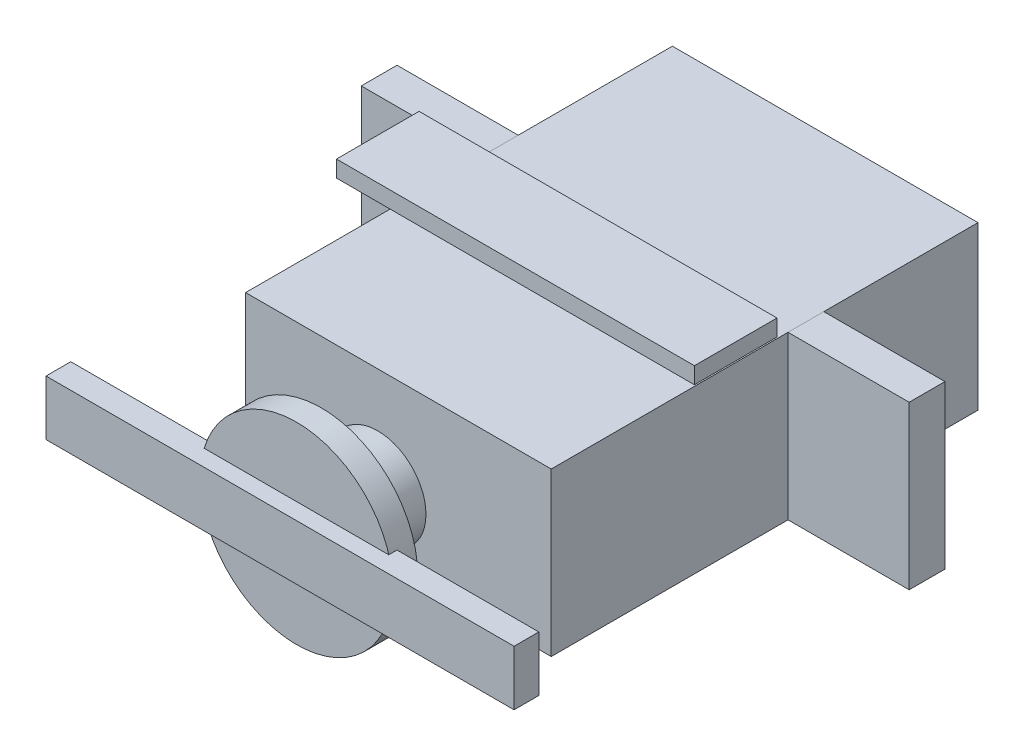
ISO-10303-21;
HEADER;
FILE_DESCRIPTION(('STEP AP214'),'2;1');
FILE_NAME('part.step','',(''),(''),'','','');
FILE_SCHEMA(('AUTOMOTIVE_DESIGN { 1 0 10303 214 1 1 1 1 }'));
ENDSEC;
DATA;
#1=APPLICATION_CONTEXT('core data for automotive mechanical design processes');
#2=APPLICATION_PROTOCOL_DEFINITION('international standard','automotive_design',2000,#1);
#3=PRODUCT_CONTEXT('',#1,'mechanical');
#4=PRODUCT('Part','Part','',(#3));
#5=PRODUCT_RELATED_PRODUCT_CATEGORY('part','',(#4));
#6=PRODUCT_DEFINITION_FORMATION('','',#4);
#7=PRODUCT_DEFINITION_CONTEXT('part definition',#1,'design');
#8=PRODUCT_DEFINITION('design','',#6,#7);
#9=PRODUCT_DEFINITION_SHAPE('','',#8);
#10=(LENGTH_UNIT() NAMED_UNIT(*) SI_UNIT(.MILLI.,.METRE.));
#11=(NAMED_UNIT(*) PLANE_ANGLE_UNIT() SI_UNIT($,.RADIAN.));
#12=(NAMED_UNIT(*) SI_UNIT($,.STERADIAN.) SOLID_ANGLE_UNIT());
#13=UNCERTAINTY_MEASURE_WITH_UNIT(LENGTH_MEASURE(1.E-05),#10,'distance_accuracy_value','');
#14=(GEOMETRIC_REPRESENTATION_CONTEXT(3) GLOBAL_UNCERTAINTY_ASSIGNED_CONTEXT((#13)) GLOBAL_UNIT_ASSIGNED_CONTEXT((#10,
#11,#12)) REPRESENTATION_CONTEXT('',''));
#15=CARTESIAN_POINT('',(0.,0.,0.));
#16=DIRECTION('',(0.,0.,1.));
#17=DIRECTION('',(1.,0.,0.));
#18=AXIS2_PLACEMENT_3D('',#15,#16,#17);
#19=CARTESIAN_POINT('',(13.,7.9,7.));
#20=DIRECTION('',(-1.,0.,0.));
#21=DIRECTION('',(0.,0.,1.));
#22=AXIS2_PLACEMENT_3D('',#19,#20,#21);
#23=PLANE('',#22);
#24=DIRECTION('',(0.,1.,0.));
#25=VECTOR('',#24,1.);
#26=CARTESIAN_POINT('',(13.,7.9,1.));
#27=LINE('',#26,#25);
#28=CARTESIAN_POINT('',(13.,7.9,1.));
#29=VERTEX_POINT('',#28);
#30=CARTESIAN_POINT('',(13.,9.1,1.));
#31=VERTEX_POINT('',#30);
#32=EDGE_CURVE('E109',#29,#31,#27,.T.);
#33=ORIENTED_EDGE('',*,*,#32,.T.);
#34=DIRECTION('',(0.,0.,-1.));
#35=VECTOR('',#34,1.);
#36=CARTESIAN_POINT('',(13.,9.1,7.));
#37=LINE('',#36,#35);
#38=CARTESIAN_POINT('',(13.,9.1,7.));
#39=VERTEX_POINT('',#38);
#40=EDGE_CURVE('E12',#39,#31,#37,.T.);
#41=ORIENTED_EDGE('',*,*,#40,.F.);
#42=DIRECTION('',(0.,1.,0.));
#43=VECTOR('',#42,1.);
#44=CARTESIAN_POINT('',(13.,7.9,7.));
#45=LINE('',#44,#43);
#46=CARTESIAN_POINT('',(13.,7.9,7.));
#47=VERTEX_POINT('',#46);
#48=EDGE_CURVE('E97',#47,#39,#45,.T.);
#49=ORIENTED_EDGE('',*,*,#48,.F.);
#50=DIRECTION('',(0.,0.,-1.));
#51=VECTOR('',#50,1.);
#52=CARTESIAN_POINT('',(13.,7.9,7.));
#53=LINE('',#52,#51);
#54=EDGE_CURVE('E105',#47,#29,#53,.T.);
#55=ORIENTED_EDGE('',*,*,#54,.T.);
#56=EDGE_LOOP('',(#33,#41,#49,#55));
#57=FACE_BOUND('',#56,.T.);
#58=ADVANCED_FACE('F46',(#57),#23,.F.);
#59=CARTESIAN_POINT('',(-13.,9.1,7.));
#60=DIRECTION('',(0.,-1.,0.));
#61=DIRECTION('',(0.,0.,-1.));
#62=AXIS2_PLACEMENT_3D('',#59,#60,#61);
#63=PLANE('',#62);
#64=DIRECTION('',(-1.,0.,0.));
#65=VECTOR('',#64,1.);
#66=CARTESIAN_POINT('',(-13.,9.1,1.));
#67=LINE('',#66,#65);
#68=CARTESIAN_POINT('',(-13.,9.1,1.));
#69=VERTEX_POINT('',#68);
#70=EDGE_CURVE('E101',#31,#69,#67,.T.);
#71=ORIENTED_EDGE('',*,*,#70,.T.);
#72=DIRECTION('',(0.,0.,-1.));
#73=VECTOR('',#72,1.);
#74=CARTESIAN_POINT('',(-13.,9.1,7.));
#75=LINE('',#74,#73);
#76=CARTESIAN_POINT('',(-13.,9.1,7.));
#77=VERTEX_POINT('',#76);
#78=EDGE_CURVE('E54',#77,#69,#75,.T.);
#79=ORIENTED_EDGE('',*,*,#78,.F.);
#80=DIRECTION('',(-1.,0.,0.));
#81=VECTOR('',#80,1.);
#82=CARTESIAN_POINT('',(-13.,9.1,7.));
#83=LINE('',#82,#81);
#84=EDGE_CURVE('E92',#39,#77,#83,.T.);
#85=ORIENTED_EDGE('',*,*,#84,.F.);
#86=ORIENTED_EDGE('',*,*,#40,.T.);
#87=EDGE_LOOP('',(#71,#79,#85,#86));
#88=FACE_BOUND('',#87,.T.);
#89=ADVANCED_FACE('F100',(#88),#63,.F.);
#90=CARTESIAN_POINT('',(-13.,7.9,7.));
#91=DIRECTION('',(1.,0.,0.));
#92=DIRECTION('',(0.,0.,-1.));
#93=AXIS2_PLACEMENT_3D('',#90,#91,#92);
#94=PLANE('',#93);
#95=DIRECTION('',(0.,-1.,0.));
#96=VECTOR('',#95,1.);
#97=CARTESIAN_POINT('',(-13.,7.9,1.));
#98=LINE('',#97,#96);
#99=CARTESIAN_POINT('',(-13.,7.9,1.));
#100=VERTEX_POINT('',#99);
#101=EDGE_CURVE('E79',#69,#100,#98,.T.);
#102=ORIENTED_EDGE('',*,*,#101,.T.);
#103=DIRECTION('',(0.,0.,-1.));
#104=VECTOR('',#103,1.);
#105=CARTESIAN_POINT('',(-13.,7.9,7.));
#106=LINE('',#105,#104);
#107=CARTESIAN_POINT('',(-13.,7.9,7.));
#108=VERTEX_POINT('',#107);
#109=EDGE_CURVE('E102',#108,#100,#106,.T.);
#110=ORIENTED_EDGE('',*,*,#109,.F.);
#111=DIRECTION('',(0.,-1.,0.));
#112=VECTOR('',#111,1.);
#113=CARTESIAN_POINT('',(-13.,7.9,7.));
#114=LINE('',#113,#112);
#115=EDGE_CURVE('E95',#77,#108,#114,.T.);
#116=ORIENTED_EDGE('',*,*,#115,.F.);
#117=ORIENTED_EDGE('',*,*,#78,.T.);
#118=EDGE_LOOP('',(#102,#110,#116,#117));
#119=FACE_BOUND('',#118,.T.);
#120=ADVANCED_FACE('F103',(#119),#94,.F.);
#121=CARTESIAN_POINT('',(-13.,7.9,7.));
#122=DIRECTION('',(0.,1.,0.));
#123=DIRECTION('',(0.,0.,1.));
#124=AXIS2_PLACEMENT_3D('',#121,#122,#123);
#125=PLANE('',#124);
#126=DIRECTION('',(1.,0.,0.));
#127=VECTOR('',#126,1.);
#128=CARTESIAN_POINT('',(-13.,7.9,1.));
#129=LINE('',#128,#127);
#130=EDGE_CURVE('E85',#100,#29,#129,.T.);
#131=ORIENTED_EDGE('',*,*,#130,.T.);
#132=ORIENTED_EDGE('',*,*,#54,.F.);
#133=DIRECTION('',(1.,0.,0.));
#134=VECTOR('',#133,1.);
#135=CARTESIAN_POINT('',(-13.,7.9,7.));
#136=LINE('',#135,#134);
#137=EDGE_CURVE('E62',#108,#47,#136,.T.);
#138=ORIENTED_EDGE('',*,*,#137,.F.);
#139=ORIENTED_EDGE('',*,*,#109,.T.);
#140=EDGE_LOOP('',(#131,#132,#138,#139));
#141=FACE_BOUND('',#140,.T.);
#142=ADVANCED_FACE('F116',(#141),#125,.F.);
#143=CARTESIAN_POINT('',(0.,0.,7.));
#144=DIRECTION('',(0.,0.,-1.));
#145=DIRECTION('',(-1.,0.,0.));
#146=AXIS2_PLACEMENT_3D('',#143,#144,#145);
#147=PLANE('',#146);
#148=ORIENTED_EDGE('',*,*,#48,.T.);
#149=ORIENTED_EDGE('',*,*,#84,.T.);
#150=ORIENTED_EDGE('',*,*,#115,.T.);
#151=ORIENTED_EDGE('',*,*,#137,.T.);
#152=EDGE_LOOP('',(#148,#149,#150,#151));
#153=FACE_BOUND('',#152,.T.);
#154=ADVANCED_FACE('F93',(#153),#147,.F.);
#155=CARTESIAN_POINT('',(0.,0.,1.));
#156=DIRECTION('',(0.,0.,-1.));
#157=DIRECTION('',(-1.,0.,0.));
#158=AXIS2_PLACEMENT_3D('',#155,#156,#157);
#159=PLANE('',#158);
#160=ORIENTED_EDGE('',*,*,#32,.F.);
#161=ORIENTED_EDGE('',*,*,#130,.F.);
#162=ORIENTED_EDGE('',*,*,#101,.F.);
#163=ORIENTED_EDGE('',*,*,#70,.F.);
#164=EDGE_LOOP('',(#160,#161,#162,#163));
#165=FACE_BOUND('',#164,.T.);
#166=ADVANCED_FACE('F119',(#165),#159,.T.);
#167=CLOSED_SHELL('',(#58,#89,#120,#142,#154,#166));
#168=MANIFOLD_SOLID_BREP('B2',#167);
#169=CARTESIAN_POINT('',(17.,-2.,24.1));
#170=DIRECTION('',(-1.,0.,0.));
#171=DIRECTION('',(0.,0.,1.));
#172=AXIS2_PLACEMENT_3D('',#169,#170,#171);
#173=PLANE('',#172);
#174=DIRECTION('',(0.,1.,0.));
#175=VECTOR('',#174,1.);
#176=CARTESIAN_POINT('',(17.,-2.,22.3));
#177=LINE('',#176,#175);
#178=CARTESIAN_POINT('',(17.,-2.,22.3));
#179=VERTEX_POINT('',#178);
#180=CARTESIAN_POINT('',(17.,2.,22.3));
#181=VERTEX_POINT('',#180);
#182=EDGE_CURVE('E241',#179,#181,#177,.T.);
#183=ORIENTED_EDGE('',*,*,#182,.T.);
#184=DIRECTION('',(0.,0.,-1.));
#185=VECTOR('',#184,1.);
#186=CARTESIAN_POINT('',(17.,2.,24.1));
#187=LINE('',#186,#185);
#188=CARTESIAN_POINT('',(17.,2.,24.1));
#189=VERTEX_POINT('',#188);
#190=EDGE_CURVE('E44',#189,#181,#187,.T.);
#191=ORIENTED_EDGE('',*,*,#190,.F.);
#192=DIRECTION('',(0.,1.,0.));
#193=VECTOR('',#192,1.);
#194=CARTESIAN_POINT('',(17.,-2.,24.1));
#195=LINE('',#194,#193);
#196=CARTESIAN_POINT('',(17.,-2.,24.1));
#197=VERTEX_POINT('',#196);
#198=EDGE_CURVE('E229',#197,#189,#195,.T.);
#199=ORIENTED_EDGE('',*,*,#198,.F.);
#200=DIRECTION('',(0.,0.,-1.));
#201=VECTOR('',#200,1.);
#202=CARTESIAN_POINT('',(17.,-2.,24.1));
#203=LINE('',#202,#201);
#204=EDGE_CURVE('E237',#197,#179,#203,.T.);
#205=ORIENTED_EDGE('',*,*,#204,.T.);
#206=EDGE_LOOP('',(#183,#191,#199,#205));
#207=FACE_BOUND('',#206,.T.);
#208=ADVANCED_FACE('F178',(#207),#173,.F.);
#209=CARTESIAN_POINT('',(-17.,2.,24.1));
#210=DIRECTION('',(0.,-1.,0.));
#211=DIRECTION('',(0.,0.,-1.));
#212=AXIS2_PLACEMENT_3D('',#209,#210,#211);
#213=PLANE('',#212);
#214=DIRECTION('',(-1.,0.,0.));
#215=VECTOR('',#214,1.);
#216=CARTESIAN_POINT('',(-17.,2.,22.3));
#217=LINE('',#216,#215);
#218=CARTESIAN_POINT('',(-17.,2.,22.3));
#219=VERTEX_POINT('',#218);
#220=EDGE_CURVE('E233',#181,#219,#217,.T.);
#221=ORIENTED_EDGE('',*,*,#220,.T.);
#222=DIRECTION('',(0.,0.,-1.));
#223=VECTOR('',#222,1.);
#224=CARTESIAN_POINT('',(-17.,2.,24.1));
#225=LINE('',#224,#223);
#226=CARTESIAN_POINT('',(-17.,2.,24.1));
#227=VERTEX_POINT('',#226);
#228=EDGE_CURVE('E186',#227,#219,#225,.T.);
#229=ORIENTED_EDGE('',*,*,#228,.F.);
#230=DIRECTION('',(-1.,0.,0.));
#231=VECTOR('',#230,1.);
#232=CARTESIAN_POINT('',(-17.,2.,24.1));
#233=LINE('',#232,#231);
#234=EDGE_CURVE('E224',#189,#227,#233,.T.);
#235=ORIENTED_EDGE('',*,*,#234,.F.);
#236=ORIENTED_EDGE('',*,*,#190,.T.);
#237=EDGE_LOOP('',(#221,#229,#235,#236));
#238=FACE_BOUND('',#237,.T.);
#239=ADVANCED_FACE('F232',(#238),#213,.F.);
#240=CARTESIAN_POINT('',(-17.,-2.,24.1));
#241=DIRECTION('',(1.,0.,0.));
#242=DIRECTION('',(0.,0.,-1.));
#243=AXIS2_PLACEMENT_3D('',#240,#241,#242);
#244=PLANE('',#243);
#245=DIRECTION('',(0.,-1.,0.));
#246=VECTOR('',#245,1.);
#247=CARTESIAN_POINT('',(-17.,-2.,22.3));
#248=LINE('',#247,#246);
#249=CARTESIAN_POINT('',(-17.,-2.,22.3));
#250=VERTEX_POINT('',#249);
#251=EDGE_CURVE('E211',#219,#250,#248,.T.);
#252=ORIENTED_EDGE('',*,*,#251,.T.);
#253=DIRECTION('',(0.,0.,-1.));
#254=VECTOR('',#253,1.);
#255=CARTESIAN_POINT('',(-17.,-2.,24.1));
#256=LINE('',#255,#254);
#257=CARTESIAN_POINT('',(-17.,-2.,24.1));
#258=VERTEX_POINT('',#257);
#259=EDGE_CURVE('E234',#258,#250,#256,.T.);
#260=ORIENTED_EDGE('',*,*,#259,.F.);
#261=DIRECTION('',(0.,-1.,0.));
#262=VECTOR('',#261,1.);
#263=CARTESIAN_POINT('',(-17.,-2.,24.1));
#264=LINE('',#263,#262);
#265=EDGE_CURVE('E227',#227,#258,#264,.T.);
#266=ORIENTED_EDGE('',*,*,#265,.F.);
#267=ORIENTED_EDGE('',*,*,#228,.T.);
#268=EDGE_LOOP('',(#252,#260,#266,#267));
#269=FACE_BOUND('',#268,.T.);
#270=ADVANCED_FACE('F235',(#269),#244,.F.);
#271=CARTESIAN_POINT('',(-17.,-2.,24.1));
#272=DIRECTION('',(0.,1.,0.));
#273=DIRECTION('',(0.,0.,1.));
#274=AXIS2_PLACEMENT_3D('',#271,#272,#273);
#275=PLANE('',#274);
#276=DIRECTION('',(1.,0.,0.));
#277=VECTOR('',#276,1.);
#278=CARTESIAN_POINT('',(-17.,-2.,22.3));
#279=LINE('',#278,#277);
#280=EDGE_CURVE('E217',#250,#179,#279,.T.);
#281=ORIENTED_EDGE('',*,*,#280,.T.);
#282=ORIENTED_EDGE('',*,*,#204,.F.);
#283=DIRECTION('',(1.,0.,0.));
#284=VECTOR('',#283,1.);
#285=CARTESIAN_POINT('',(-17.,-2.,24.1));
#286=LINE('',#285,#284);
#287=EDGE_CURVE('E194',#258,#197,#286,.T.);
#288=ORIENTED_EDGE('',*,*,#287,.F.);
#289=ORIENTED_EDGE('',*,*,#259,.T.);
#290=EDGE_LOOP('',(#281,#282,#288,#289));
#291=FACE_BOUND('',#290,.T.);
#292=ADVANCED_FACE('F248',(#291),#275,.F.);
#293=CARTESIAN_POINT('',(0.,0.,24.1));
#294=DIRECTION('',(0.,0.,-1.));
#295=DIRECTION('',(-1.,0.,0.));
#296=AXIS2_PLACEMENT_3D('',#293,#294,#295);
#297=PLANE('',#296);
#298=ORIENTED_EDGE('',*,*,#198,.T.);
#299=ORIENTED_EDGE('',*,*,#234,.T.);
#300=ORIENTED_EDGE('',*,*,#265,.T.);
#301=ORIENTED_EDGE('',*,*,#287,.T.);
#302=EDGE_LOOP('',(#298,#299,#300,#301));
#303=FACE_BOUND('',#302,.T.);
#304=ADVANCED_FACE('F225',(#303),#297,.F.);
#305=CARTESIAN_POINT('',(0.,0.,22.3));
#306=DIRECTION('',(0.,0.,-1.));
#307=DIRECTION('',(-1.,0.,0.));
#308=AXIS2_PLACEMENT_3D('',#305,#306,#307);
#309=PLANE('',#308);
#310=ORIENTED_EDGE('',*,*,#182,.F.);
#311=ORIENTED_EDGE('',*,*,#280,.F.);
#312=ORIENTED_EDGE('',*,*,#251,.F.);
#313=ORIENTED_EDGE('',*,*,#220,.F.);
#314=EDGE_LOOP('',(#310,#311,#312,#313));
#315=FACE_BOUND('',#314,.T.);
#316=ADVANCED_FACE('F251',(#315),#309,.T.);
#317=CLOSED_SHELL('',(#208,#239,#270,#292,#304,#316));
#318=MANIFOLD_SOLID_BREP('B6',#317);
#319=CARTESIAN_POINT('',(0.,0.,22.9));
#320=DIRECTION('',(0.,0.,-1.));
#321=DIRECTION('',(-1.,0.,0.));
#322=AXIS2_PLACEMENT_3D('',#319,#320,#321);
#323=CYLINDRICAL_SURFACE('',#322,7.);
#324=CARTESIAN_POINT('',(0.,0.,22.9));
#325=DIRECTION('',(0.,0.,1.));
#326=DIRECTION('',(1.,0.,0.));
#327=AXIS2_PLACEMENT_3D('',#324,#325,#326);
#328=CIRCLE('',#327,7.);
#329=CARTESIAN_POINT('',(7.,0.,22.9));
#330=VERTEX_POINT('',#329);
#331=EDGE_CURVE('E177',#330,#330,#328,.T.);
#332=ORIENTED_EDGE('',*,*,#331,.F.);
#333=EDGE_LOOP('',(#332));
#334=FACE_BOUND('',#333,.T.);
#335=CARTESIAN_POINT('',(0.,0.,21.1));
#336=DIRECTION('',(0.,0.,1.));
#337=DIRECTION('',(1.,0.,0.));
#338=AXIS2_PLACEMENT_3D('',#335,#336,#337);
#339=CIRCLE('',#338,7.);
#340=CARTESIAN_POINT('',(7.,0.,21.1));
#341=VERTEX_POINT('',#340);
#342=EDGE_CURVE('E313',#341,#341,#339,.T.);
#343=ORIENTED_EDGE('',*,*,#342,.T.);
#344=EDGE_LOOP('',(#343));
#345=FACE_BOUND('',#344,.T.);
#346=ADVANCED_FACE('F310',(#334,#345),#323,.T.);
#347=CARTESIAN_POINT('',(0.,0.,22.9));
#348=DIRECTION('',(0.,0.,1.));
#349=DIRECTION('',(1.,0.,0.));
#350=AXIS2_PLACEMENT_3D('',#347,#348,#349);
#351=PLANE('',#350);
#352=ORIENTED_EDGE('',*,*,#331,.T.);
#353=EDGE_LOOP('',(#352));
#354=FACE_BOUND('',#353,.T.);
#355=ADVANCED_FACE('F325',(#354),#351,.T.);
#356=CARTESIAN_POINT('',(0.,0.,21.1));
#357=DIRECTION('',(0.,0.,1.));
#358=DIRECTION('',(1.,0.,0.));
#359=AXIS2_PLACEMENT_3D('',#356,#357,#358);
#360=PLANE('',#359);
#361=ORIENTED_EDGE('',*,*,#342,.F.);
#362=EDGE_LOOP('',(#361));
#363=FACE_BOUND('',#362,.T.);
#364=ADVANCED_FACE('F323',(#363),#360,.F.);
#365=CLOSED_SHELL('',(#346,#355,#364));
#366=MANIFOLD_SOLID_BREP('B38',#365);
#367=CARTESIAN_POINT('',(0.,0.,20.));
#368=DIRECTION('',(0.,0.,-1.));
#369=DIRECTION('',(-1.,0.,0.));
#370=AXIS2_PLACEMENT_3D('',#367,#368,#369);
#371=CYLINDRICAL_SURFACE('',#370,3.5);
#372=CARTESIAN_POINT('',(0.,0.,20.));
#373=DIRECTION('',(0.,0.,1.));
#374=DIRECTION('',(1.,0.,0.));
#375=AXIS2_PLACEMENT_3D('',#372,#373,#374);
#376=CIRCLE('',#375,3.5);
#377=CARTESIAN_POINT('',(3.5,0.,20.));
#378=VERTEX_POINT('',#377);
#379=EDGE_CURVE('E309',#378,#378,#376,.T.);
#380=ORIENTED_EDGE('',*,*,#379,.F.);
#381=EDGE_LOOP('',(#380));
#382=FACE_BOUND('',#381,.T.);
#383=CARTESIAN_POINT('',(0.,0.,17.));
#384=DIRECTION('',(0.,0.,1.));
#385=DIRECTION('',(1.,0.,0.));
#386=AXIS2_PLACEMENT_3D('',#383,#384,#385);
#387=CIRCLE('',#386,3.5);
#388=CARTESIAN_POINT('',(3.5,0.,17.));
#389=VERTEX_POINT('',#388);
#390=EDGE_CURVE('E364',#389,#389,#387,.T.);
#391=ORIENTED_EDGE('',*,*,#390,.T.);
#392=EDGE_LOOP('',(#391));
#393=FACE_BOUND('',#392,.T.);
#394=ADVANCED_FACE('F361',(#382,#393),#371,.T.);
#395=CARTESIAN_POINT('',(0.,0.,20.));
#396=DIRECTION('',(0.,0.,1.));
#397=DIRECTION('',(1.,0.,0.));
#398=AXIS2_PLACEMENT_3D('',#395,#396,#397);
#399=PLANE('',#398);
#400=ORIENTED_EDGE('',*,*,#379,.T.);
#401=EDGE_LOOP('',(#400));
#402=FACE_BOUND('',#401,.T.);
#403=ADVANCED_FACE('F376',(#402),#399,.T.);
#404=CARTESIAN_POINT('',(0.,0.,17.));
#405=DIRECTION('',(0.,0.,1.));
#406=DIRECTION('',(1.,0.,0.));
#407=AXIS2_PLACEMENT_3D('',#404,#405,#406);
#408=PLANE('',#407);
#409=ORIENTED_EDGE('',*,*,#390,.F.);
#410=EDGE_LOOP('',(#409));
#411=FACE_BOUND('',#410,.T.);
#412=ADVANCED_FACE('F374',(#411),#408,.F.);
#413=CLOSED_SHELL('',(#394,#403,#412));
#414=MANIFOLD_SOLID_BREP('B172',#413);
#415=CARTESIAN_POINT('',(19.9,-5.9,-1.7));
#416=DIRECTION('',(-1.,0.,0.));
#417=DIRECTION('',(0.,0.,1.));
#418=AXIS2_PLACEMENT_3D('',#415,#416,#417);
#419=PLANE('',#418);
#420=DIRECTION('',(0.,1.,0.));
#421=VECTOR('',#420,1.);
#422=CARTESIAN_POINT('',(19.9,-5.9,-4.3));
#423=LINE('',#422,#421);
#424=CARTESIAN_POINT('',(19.9,-5.9,-4.3));
#425=VERTEX_POINT('',#424);
#426=CARTESIAN_POINT('',(19.9,5.9,-4.3));
#427=VERTEX_POINT('',#426);
#428=EDGE_CURVE('E475',#425,#427,#423,.T.);
#429=ORIENTED_EDGE('',*,*,#428,.T.);
#430=DIRECTION('',(0.,0.,-1.));
#431=VECTOR('',#430,1.);
#432=CARTESIAN_POINT('',(19.9,5.9,-1.7));
#433=LINE('',#432,#431);
#434=CARTESIAN_POINT('',(19.9,5.9,-1.7));
#435=VERTEX_POINT('',#434);
#436=EDGE_CURVE('E359',#435,#427,#433,.T.);
#437=ORIENTED_EDGE('',*,*,#436,.F.);
#438=DIRECTION('',(0.,1.,0.));
#439=VECTOR('',#438,1.);
#440=CARTESIAN_POINT('',(19.9,-5.9,-1.7));
#441=LINE('',#440,#439);
#442=CARTESIAN_POINT('',(19.9,-5.9,-1.7));
#443=VERTEX_POINT('',#442);
#444=EDGE_CURVE('E463',#443,#435,#441,.T.);
#445=ORIENTED_EDGE('',*,*,#444,.F.);
#446=DIRECTION('',(0.,0.,-1.));
#447=VECTOR('',#446,1.);
#448=CARTESIAN_POINT('',(19.9,-5.9,-1.7));
#449=LINE('',#448,#447);
#450=EDGE_CURVE('E471',#443,#425,#449,.T.);
#451=ORIENTED_EDGE('',*,*,#450,.T.);
#452=EDGE_LOOP('',(#429,#437,#445,#451));
#453=FACE_BOUND('',#452,.T.);
#454=ADVANCED_FACE('F412',(#453),#419,.F.);
#455=CARTESIAN_POINT('',(11.1,5.9,-1.7));
#456=DIRECTION('',(0.,-1.,0.));
#457=DIRECTION('',(0.,0.,-1.));
#458=AXIS2_PLACEMENT_3D('',#455,#456,#457);
#459=PLANE('',#458);
#460=DIRECTION('',(-1.,0.,0.));
#461=VECTOR('',#460,1.);
#462=CARTESIAN_POINT('',(11.1,5.9,-4.3));
#463=LINE('',#462,#461);
#464=CARTESIAN_POINT('',(11.1,5.9,-4.3));
#465=VERTEX_POINT('',#464);
#466=EDGE_CURVE('E467',#427,#465,#463,.T.);
#467=ORIENTED_EDGE('',*,*,#466,.T.);
#468=DIRECTION('',(0.,0.,-1.));
#469=VECTOR('',#468,1.);
#470=CARTESIAN_POINT('',(11.1,5.9,-1.7));
#471=LINE('',#470,#469);
#472=CARTESIAN_POINT('',(11.1,5.9,-1.7));
#473=VERTEX_POINT('',#472);
#474=EDGE_CURVE('E420',#473,#465,#471,.T.);
#475=ORIENTED_EDGE('',*,*,#474,.F.);
#476=DIRECTION('',(-1.,0.,0.));
#477=VECTOR('',#476,1.);
#478=CARTESIAN_POINT('',(11.1,5.9,-1.7));
#479=LINE('',#478,#477);
#480=EDGE_CURVE('E458',#435,#473,#479,.T.);
#481=ORIENTED_EDGE('',*,*,#480,.F.);
#482=ORIENTED_EDGE('',*,*,#436,.T.);
#483=EDGE_LOOP('',(#467,#475,#481,#482));
#484=FACE_BOUND('',#483,.T.);
#485=ADVANCED_FACE('F466',(#484),#459,.F.);
#486=CARTESIAN_POINT('',(11.1,-5.9,-1.7));
#487=DIRECTION('',(1.,0.,0.));
#488=DIRECTION('',(0.,0.,-1.));
#489=AXIS2_PLACEMENT_3D('',#486,#487,#488);
#490=PLANE('',#489);
#491=DIRECTION('',(0.,-1.,0.));
#492=VECTOR('',#491,1.);
#493=CARTESIAN_POINT('',(11.1,-5.9,-4.3));
#494=LINE('',#493,#492);
#495=CARTESIAN_POINT('',(11.1,-5.9,-4.3));
#496=VERTEX_POINT('',#495);
#497=EDGE_CURVE('E445',#465,#496,#494,.T.);
#498=ORIENTED_EDGE('',*,*,#497,.T.);
#499=DIRECTION('',(0.,0.,-1.));
#500=VECTOR('',#499,1.);
#501=CARTESIAN_POINT('',(11.1,-5.9,-1.7));
#502=LINE('',#501,#500);
#503=CARTESIAN_POINT('',(11.1,-5.9,-1.7));
#504=VERTEX_POINT('',#503);
#505=EDGE_CURVE('E468',#504,#496,#502,.T.);
#506=ORIENTED_EDGE('',*,*,#505,.F.);
#507=DIRECTION('',(0.,-1.,0.));
#508=VECTOR('',#507,1.);
#509=CARTESIAN_POINT('',(11.1,-5.9,-1.7));
#510=LINE('',#509,#508);
#511=EDGE_CURVE('E461',#473,#504,#510,.T.);
#512=ORIENTED_EDGE('',*,*,#511,.F.);
#513=ORIENTED_EDGE('',*,*,#474,.T.);
#514=EDGE_LOOP('',(#498,#506,#512,#513));
#515=FACE_BOUND('',#514,.T.);
#516=ADVANCED_FACE('F469',(#515),#490,.F.);
#517=CARTESIAN_POINT('',(11.1,-5.9,-1.7));
#518=DIRECTION('',(0.,1.,0.));
#519=DIRECTION('',(0.,0.,1.));
#520=AXIS2_PLACEMENT_3D('',#517,#518,#519);
#521=PLANE('',#520);
#522=DIRECTION('',(1.,0.,0.));
#523=VECTOR('',#522,1.);
#524=CARTESIAN_POINT('',(11.1,-5.9,-4.3));
#525=LINE('',#524,#523);
#526=EDGE_CURVE('E451',#496,#425,#525,.T.);
#527=ORIENTED_EDGE('',*,*,#526,.T.);
#528=ORIENTED_EDGE('',*,*,#450,.F.);
#529=DIRECTION('',(1.,0.,0.));
#530=VECTOR('',#529,1.);
#531=CARTESIAN_POINT('',(11.1,-5.9,-1.7));
#532=LINE('',#531,#530);
#533=EDGE_CURVE('E428',#504,#443,#532,.T.);
#534=ORIENTED_EDGE('',*,*,#533,.F.);
#535=ORIENTED_EDGE('',*,*,#505,.T.);
#536=EDGE_LOOP('',(#527,#528,#534,#535));
#537=FACE_BOUND('',#536,.T.);
#538=ADVANCED_FACE('F482',(#537),#521,.F.);
#539=CARTESIAN_POINT('',(0.,0.,-1.7));
#540=DIRECTION('',(0.,0.,-1.));
#541=DIRECTION('',(-1.,0.,0.));
#542=AXIS2_PLACEMENT_3D('',#539,#540,#541);
#543=PLANE('',#542);
#544=ORIENTED_EDGE('',*,*,#444,.T.);
#545=ORIENTED_EDGE('',*,*,#480,.T.);
#546=ORIENTED_EDGE('',*,*,#511,.T.);
#547=ORIENTED_EDGE('',*,*,#533,.T.);
#548=EDGE_LOOP('',(#544,#545,#546,#547));
#549=FACE_BOUND('',#548,.T.);
#550=ADVANCED_FACE('F459',(#549),#543,.F.);
#551=CARTESIAN_POINT('',(0.,0.,-4.3));
#552=DIRECTION('',(0.,0.,-1.));
#553=DIRECTION('',(-1.,0.,0.));
#554=AXIS2_PLACEMENT_3D('',#551,#552,#553);
#555=PLANE('',#554);
#556=ORIENTED_EDGE('',*,*,#428,.F.);
#557=ORIENTED_EDGE('',*,*,#526,.F.);
#558=ORIENTED_EDGE('',*,*,#497,.F.);
#559=ORIENTED_EDGE('',*,*,#466,.F.);
#560=EDGE_LOOP('',(#556,#557,#558,#559));
#561=FACE_BOUND('',#560,.T.);
#562=ADVANCED_FACE('F485',(#561),#555,.T.);
#563=CLOSED_SHELL('',(#454,#485,#516,#538,#550,#562));
#564=MANIFOLD_SOLID_BREP('B304',#563);
#565=CARTESIAN_POINT('',(-11.1,-5.9,-1.7));
#566=DIRECTION('',(-1.,0.,0.));
#567=DIRECTION('',(0.,0.,1.));
#568=AXIS2_PLACEMENT_3D('',#565,#566,#567);
#569=PLANE('',#568);
#570=DIRECTION('',(0.,1.,0.));
#571=VECTOR('',#570,1.);
#572=CARTESIAN_POINT('',(-11.1,-5.9,-4.3));
#573=LINE('',#572,#571);
#574=CARTESIAN_POINT('',(-11.1,-5.9,-4.3));
#575=VERTEX_POINT('',#574);
#576=CARTESIAN_POINT('',(-11.1,5.9,-4.3));
#577=VERTEX_POINT('',#576);
#578=EDGE_CURVE('E608',#575,#577,#573,.T.);
#579=ORIENTED_EDGE('',*,*,#578,.T.);
#580=DIRECTION('',(0.,0.,-1.));
#581=VECTOR('',#580,1.);
#582=CARTESIAN_POINT('',(-11.1,5.9,-1.7));
#583=LINE('',#582,#581);
#584=CARTESIAN_POINT('',(-11.1,5.9,-1.7));
#585=VERTEX_POINT('',#584);
#586=EDGE_CURVE('E410',#585,#577,#583,.T.);
#587=ORIENTED_EDGE('',*,*,#586,.F.);
#588=DIRECTION('',(0.,1.,0.));
#589=VECTOR('',#588,1.);
#590=CARTESIAN_POINT('',(-11.1,-5.9,-1.7));
#591=LINE('',#590,#589);
#592=CARTESIAN_POINT('',(-11.1,-5.9,-1.7));
#593=VERTEX_POINT('',#592);
#594=EDGE_CURVE('E596',#593,#585,#591,.T.);
#595=ORIENTED_EDGE('',*,*,#594,.F.);
#596=DIRECTION('',(0.,0.,-1.));
#597=VECTOR('',#596,1.);
#598=CARTESIAN_POINT('',(-11.1,-5.9,-1.7));
#599=LINE('',#598,#597);
#600=EDGE_CURVE('E604',#593,#575,#599,.T.);
#601=ORIENTED_EDGE('',*,*,#600,.T.);
#602=EDGE_LOOP('',(#579,#587,#595,#601));
#603=FACE_BOUND('',#602,.T.);
#604=ADVANCED_FACE('F545',(#603),#569,.F.);
#605=CARTESIAN_POINT('',(-19.9,5.9,-1.7));
#606=DIRECTION('',(0.,-1.,0.));
#607=DIRECTION('',(0.,0.,-1.));
#608=AXIS2_PLACEMENT_3D('',#605,#606,#607);
#609=PLANE('',#608);
#610=DIRECTION('',(-1.,0.,0.));
#611=VECTOR('',#610,1.);
#612=CARTESIAN_POINT('',(-19.9,5.9,-4.3));
#613=LINE('',#612,#611);
#614=CARTESIAN_POINT('',(-19.9,5.9,-4.3));
#615=VERTEX_POINT('',#614);
#616=EDGE_CURVE('E600',#577,#615,#613,.T.);
#617=ORIENTED_EDGE('',*,*,#616,.T.);
#618=DIRECTION('',(0.,0.,-1.));
#619=VECTOR('',#618,1.);
#620=CARTESIAN_POINT('',(-19.9,5.9,-1.7));
#621=LINE('',#620,#619);
#622=CARTESIAN_POINT('',(-19.9,5.9,-1.7));
#623=VERTEX_POINT('',#622);
#624=EDGE_CURVE('E553',#623,#615,#621,.T.);
#625=ORIENTED_EDGE('',*,*,#624,.F.);
#626=DIRECTION('',(-1.,0.,0.));
#627=VECTOR('',#626,1.);
#628=CARTESIAN_POINT('',(-19.9,5.9,-1.7));
#629=LINE('',#628,#627);
#630=EDGE_CURVE('E591',#585,#623,#629,.T.);
#631=ORIENTED_EDGE('',*,*,#630,.F.);
#632=ORIENTED_EDGE('',*,*,#586,.T.);
#633=EDGE_LOOP('',(#617,#625,#631,#632));
#634=FACE_BOUND('',#633,.T.);
#635=ADVANCED_FACE('F599',(#634),#609,.F.);
#636=CARTESIAN_POINT('',(-19.9,-5.9,-1.7));
#637=DIRECTION('',(1.,0.,0.));
#638=DIRECTION('',(0.,0.,-1.));
#639=AXIS2_PLACEMENT_3D('',#636,#637,#638);
#640=PLANE('',#639);
#641=DIRECTION('',(0.,-1.,0.));
#642=VECTOR('',#641,1.);
#643=CARTESIAN_POINT('',(-19.9,-5.9,-4.3));
#644=LINE('',#643,#642);
#645=CARTESIAN_POINT('',(-19.9,-5.9,-4.3));
#646=VERTEX_POINT('',#645);
#647=EDGE_CURVE('E578',#615,#646,#644,.T.);
#648=ORIENTED_EDGE('',*,*,#647,.T.);
#649=DIRECTION('',(0.,0.,-1.));
#650=VECTOR('',#649,1.);
#651=CARTESIAN_POINT('',(-19.9,-5.9,-1.7));
#652=LINE('',#651,#650);
#653=CARTESIAN_POINT('',(-19.9,-5.9,-1.7));
#654=VERTEX_POINT('',#653);
#655=EDGE_CURVE('E601',#654,#646,#652,.T.);
#656=ORIENTED_EDGE('',*,*,#655,.F.);
#657=DIRECTION('',(0.,-1.,0.));
#658=VECTOR('',#657,1.);
#659=CARTESIAN_POINT('',(-19.9,-5.9,-1.7));
#660=LINE('',#659,#658);
#661=EDGE_CURVE('E594',#623,#654,#660,.T.);
#662=ORIENTED_EDGE('',*,*,#661,.F.);
#663=ORIENTED_EDGE('',*,*,#624,.T.);
#664=EDGE_LOOP('',(#648,#656,#662,#663));
#665=FACE_BOUND('',#664,.T.);
#666=ADVANCED_FACE('F602',(#665),#640,.F.);
#667=CARTESIAN_POINT('',(-19.9,-5.9,-1.7));
#668=DIRECTION('',(0.,1.,0.));
#669=DIRECTION('',(0.,0.,1.));
#670=AXIS2_PLACEMENT_3D('',#667,#668,#669);
#671=PLANE('',#670);
#672=DIRECTION('',(1.,0.,0.));
#673=VECTOR('',#672,1.);
#674=CARTESIAN_POINT('',(-19.9,-5.9,-4.3));
#675=LINE('',#674,#673);
#676=EDGE_CURVE('E584',#646,#575,#675,.T.);
#677=ORIENTED_EDGE('',*,*,#676,.T.);
#678=ORIENTED_EDGE('',*,*,#600,.F.);
#679=DIRECTION('',(1.,0.,0.));
#680=VECTOR('',#679,1.);
#681=CARTESIAN_POINT('',(-19.9,-5.9,-1.7));
#682=LINE('',#681,#680);
#683=EDGE_CURVE('E561',#654,#593,#682,.T.);
#684=ORIENTED_EDGE('',*,*,#683,.F.);
#685=ORIENTED_EDGE('',*,*,#655,.T.);
#686=EDGE_LOOP('',(#677,#678,#684,#685));
#687=FACE_BOUND('',#686,.T.);
#688=ADVANCED_FACE('F615',(#687),#671,.F.);
#689=CARTESIAN_POINT('',(0.,0.,-1.7));
#690=DIRECTION('',(0.,0.,-1.));
#691=DIRECTION('',(-1.,0.,0.));
#692=AXIS2_PLACEMENT_3D('',#689,#690,#691);
#693=PLANE('',#692);
#694=ORIENTED_EDGE('',*,*,#594,.T.);
#695=ORIENTED_EDGE('',*,*,#630,.T.);
#696=ORIENTED_EDGE('',*,*,#661,.T.);
#697=ORIENTED_EDGE('',*,*,#683,.T.);
#698=EDGE_LOOP('',(#694,#695,#696,#697));
#699=FACE_BOUND('',#698,.T.);
#700=ADVANCED_FACE('F592',(#699),#693,.F.);
#701=CARTESIAN_POINT('',(0.,0.,-4.3));
#702=DIRECTION('',(0.,0.,-1.));
#703=DIRECTION('',(-1.,0.,0.));
#704=AXIS2_PLACEMENT_3D('',#701,#702,#703);
#705=PLANE('',#704);
#706=ORIENTED_EDGE('',*,*,#578,.F.);
#707=ORIENTED_EDGE('',*,*,#676,.F.);
#708=ORIENTED_EDGE('',*,*,#647,.F.);
#709=ORIENTED_EDGE('',*,*,#616,.F.);
#710=EDGE_LOOP('',(#706,#707,#708,#709));
#711=FACE_BOUND('',#710,.T.);
#712=ADVANCED_FACE('F618',(#711),#705,.T.);
#713=CLOSED_SHELL('',(#604,#635,#666,#688,#700,#712));
#714=MANIFOLD_SOLID_BREP('B353',#713);
#715=CARTESIAN_POINT('',(11.1,-5.9,15.5));
#716=DIRECTION('',(-1.,0.,0.));
#717=DIRECTION('',(0.,0.,1.));
#718=AXIS2_PLACEMENT_3D('',#715,#716,#717);
#719=PLANE('',#718);
#720=DIRECTION('',(0.,1.,0.));
#721=VECTOR('',#720,1.);
#722=CARTESIAN_POINT('',(11.1,-5.9,-15.5));
#723=LINE('',#722,#721);
#724=CARTESIAN_POINT('',(11.1,-5.9,-15.5));
#725=VERTEX_POINT('',#724);
#726=CARTESIAN_POINT('',(11.1,5.9,-15.5));
#727=VERTEX_POINT('',#726);
#728=EDGE_CURVE('E732',#725,#727,#723,.T.);
#729=ORIENTED_EDGE('',*,*,#728,.T.);
#730=DIRECTION('',(0.,0.,-1.));
#731=VECTOR('',#730,1.);
#732=CARTESIAN_POINT('',(11.1,5.9,15.5));
#733=LINE('',#732,#731);
#734=CARTESIAN_POINT('',(11.1,5.9,15.5));
#735=VERTEX_POINT('',#734);
#736=EDGE_CURVE('E543',#735,#727,#733,.T.);
#737=ORIENTED_EDGE('',*,*,#736,.F.);
#738=DIRECTION('',(0.,1.,0.));
#739=VECTOR('',#738,1.);
#740=CARTESIAN_POINT('',(11.1,-5.9,15.5));
#741=LINE('',#740,#739);
#742=CARTESIAN_POINT('',(11.1,-5.9,15.5));
#743=VERTEX_POINT('',#742);
#744=EDGE_CURVE('E720',#743,#735,#741,.T.);
#745=ORIENTED_EDGE('',*,*,#744,.F.);
#746=DIRECTION('',(0.,0.,-1.));
#747=VECTOR('',#746,1.);
#748=CARTESIAN_POINT('',(11.1,-5.9,15.5));
#749=LINE('',#748,#747);
#750=EDGE_CURVE('E728',#743,#725,#749,.T.);
#751=ORIENTED_EDGE('',*,*,#750,.T.);
#752=EDGE_LOOP('',(#729,#737,#745,#751));
#753=FACE_BOUND('',#752,.T.);
#754=ADVANCED_FACE('F669',(#753),#719,.F.);
#755=CARTESIAN_POINT('',(-11.1,5.9,15.5));
#756=DIRECTION('',(0.,-1.,0.));
#757=DIRECTION('',(0.,0.,-1.));
#758=AXIS2_PLACEMENT_3D('',#755,#756,#757);
#759=PLANE('',#758);
#760=DIRECTION('',(-1.,0.,0.));
#761=VECTOR('',#760,1.);
#762=CARTESIAN_POINT('',(-11.1,5.9,-15.5));
#763=LINE('',#762,#761);
#764=CARTESIAN_POINT('',(-11.1,5.9,-15.5));
#765=VERTEX_POINT('',#764);
#766=EDGE_CURVE('E724',#727,#765,#763,.T.);
#767=ORIENTED_EDGE('',*,*,#766,.T.);
#768=DIRECTION('',(0.,0.,-1.));
#769=VECTOR('',#768,1.);
#770=CARTESIAN_POINT('',(-11.1,5.9,15.5));
#771=LINE('',#770,#769);
#772=CARTESIAN_POINT('',(-11.1,5.9,15.5));
#773=VERTEX_POINT('',#772);
#774=EDGE_CURVE('E677',#773,#765,#771,.T.);
#775=ORIENTED_EDGE('',*,*,#774,.F.);
#776=DIRECTION('',(-1.,0.,0.));
#777=VECTOR('',#776,1.);
#778=CARTESIAN_POINT('',(-11.1,5.9,15.5));
#779=LINE('',#778,#777);
#780=EDGE_CURVE('E715',#735,#773,#779,.T.);
#781=ORIENTED_EDGE('',*,*,#780,.F.);
#782=ORIENTED_EDGE('',*,*,#736,.T.);
#783=EDGE_LOOP('',(#767,#775,#781,#782));
#784=FACE_BOUND('',#783,.T.);
#785=ADVANCED_FACE('F723',(#784),#759,.F.);
#786=CARTESIAN_POINT('',(-11.1,-5.9,15.5));
#787=DIRECTION('',(1.,0.,0.));
#788=DIRECTION('',(0.,0.,-1.));
#789=AXIS2_PLACEMENT_3D('',#786,#787,#788);
#790=PLANE('',#789);
#791=DIRECTION('',(0.,-1.,0.));
#792=VECTOR('',#791,1.);
#793=CARTESIAN_POINT('',(-11.1,-5.9,-15.5));
#794=LINE('',#793,#792);
#795=CARTESIAN_POINT('',(-11.1,-5.9,-15.5));
#796=VERTEX_POINT('',#795);
#797=EDGE_CURVE('E702',#765,#796,#794,.T.);
#798=ORIENTED_EDGE('',*,*,#797,.T.);
#799=DIRECTION('',(0.,0.,-1.));
#800=VECTOR('',#799,1.);
#801=CARTESIAN_POINT('',(-11.1,-5.9,15.5));
#802=LINE('',#801,#800);
#803=CARTESIAN_POINT('',(-11.1,-5.9,15.5));
#804=VERTEX_POINT('',#803);
#805=EDGE_CURVE('E725',#804,#796,#802,.T.);
#806=ORIENTED_EDGE('',*,*,#805,.F.);
#807=DIRECTION('',(0.,-1.,0.));
#808=VECTOR('',#807,1.);
#809=CARTESIAN_POINT('',(-11.1,-5.9,15.5));
#810=LINE('',#809,#808);
#811=EDGE_CURVE('E718',#773,#804,#810,.T.);
#812=ORIENTED_EDGE('',*,*,#811,.F.);
#813=ORIENTED_EDGE('',*,*,#774,.T.);
#814=EDGE_LOOP('',(#798,#806,#812,#813));
#815=FACE_BOUND('',#814,.T.);
#816=ADVANCED_FACE('F726',(#815),#790,.F.);
#817=CARTESIAN_POINT('',(-11.1,-5.9,15.5));
#818=DIRECTION('',(0.,1.,0.));
#819=DIRECTION('',(0.,0.,1.));
#820=AXIS2_PLACEMENT_3D('',#817,#818,#819);
#821=PLANE('',#820);
#822=DIRECTION('',(1.,0.,0.));
#823=VECTOR('',#822,1.);
#824=CARTESIAN_POINT('',(-11.1,-5.9,-15.5));
#825=LINE('',#824,#823);
#826=EDGE_CURVE('E708',#796,#725,#825,.T.);
#827=ORIENTED_EDGE('',*,*,#826,.T.);
#828=ORIENTED_EDGE('',*,*,#750,.F.);
#829=DIRECTION('',(1.,0.,0.));
#830=VECTOR('',#829,1.);
#831=CARTESIAN_POINT('',(-11.1,-5.9,15.5));
#832=LINE('',#831,#830);
#833=EDGE_CURVE('E685',#804,#743,#832,.T.);
#834=ORIENTED_EDGE('',*,*,#833,.F.);
#835=ORIENTED_EDGE('',*,*,#805,.T.);
#836=EDGE_LOOP('',(#827,#828,#834,#835));
#837=FACE_BOUND('',#836,.T.);
#838=ADVANCED_FACE('F739',(#837),#821,.F.);
#839=CARTESIAN_POINT('',(0.,0.,15.5));
#840=DIRECTION('',(0.,0.,-1.));
#841=DIRECTION('',(-1.,0.,0.));
#842=AXIS2_PLACEMENT_3D('',#839,#840,#841);
#843=PLANE('',#842);
#844=ORIENTED_EDGE('',*,*,#744,.T.);
#845=ORIENTED_EDGE('',*,*,#780,.T.);
#846=ORIENTED_EDGE('',*,*,#811,.T.);
#847=ORIENTED_EDGE('',*,*,#833,.T.);
#848=EDGE_LOOP('',(#844,#845,#846,#847));
#849=FACE_BOUND('',#848,.T.);
#850=ADVANCED_FACE('F716',(#849),#843,.F.);
#851=CARTESIAN_POINT('',(0.,0.,-15.5));
#852=DIRECTION('',(0.,0.,-1.));
#853=DIRECTION('',(-1.,0.,0.));
#854=AXIS2_PLACEMENT_3D('',#851,#852,#853);
#855=PLANE('',#854);
#856=ORIENTED_EDGE('',*,*,#728,.F.);
#857=ORIENTED_EDGE('',*,*,#826,.F.);
#858=ORIENTED_EDGE('',*,*,#797,.F.);
#859=ORIENTED_EDGE('',*,*,#766,.F.);
#860=EDGE_LOOP('',(#856,#857,#858,#859));
#861=FACE_BOUND('',#860,.T.);
#862=ADVANCED_FACE('F742',(#861),#855,.T.);
#863=CLOSED_SHELL('',(#754,#785,#816,#838,#850,#862));
#864=MANIFOLD_SOLID_BREP('B404',#863);
#865=ADVANCED_BREP_SHAPE_REPRESENTATION('',(#18,#168,#318,#366,#414,#564,#714,#864),#14);
#866=SHAPE_DEFINITION_REPRESENTATION(#9,#865);
ENDSEC;
END-ISO-10303-21;
